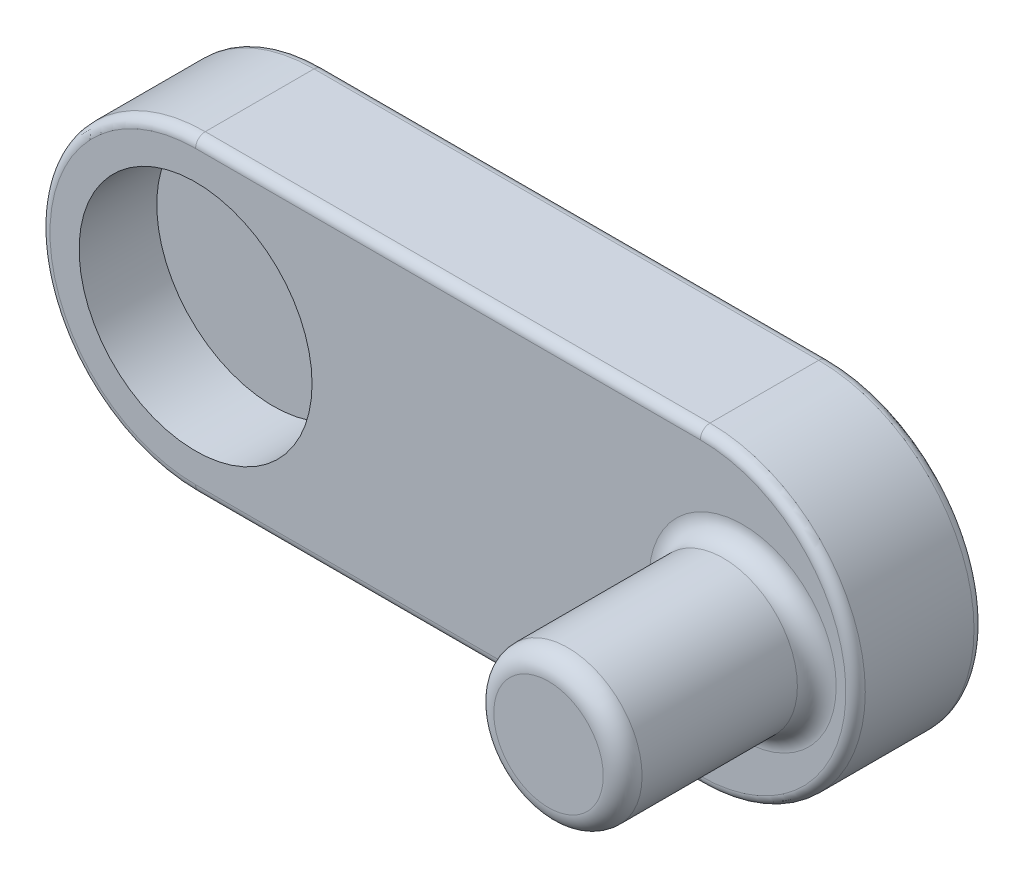
ISO-10303-21;
HEADER;
FILE_DESCRIPTION(('STEP AP214'),'2;1');
FILE_NAME('part.step','',(''),(''),'','','');
FILE_SCHEMA(('AUTOMOTIVE_DESIGN { 1 0 10303 214 1 1 1 1 }'));
ENDSEC;
DATA;
#1=APPLICATION_CONTEXT('core data for automotive mechanical design processes');
#2=APPLICATION_PROTOCOL_DEFINITION('international standard','automotive_design',2000,#1);
#3=PRODUCT_CONTEXT('',#1,'mechanical');
#4=PRODUCT('Part','Part','',(#3));
#5=PRODUCT_RELATED_PRODUCT_CATEGORY('part','',(#4));
#6=PRODUCT_DEFINITION_FORMATION('','',#4);
#7=PRODUCT_DEFINITION_CONTEXT('part definition',#1,'design');
#8=PRODUCT_DEFINITION('design','',#6,#7);
#9=PRODUCT_DEFINITION_SHAPE('','',#8);
#10=(LENGTH_UNIT() NAMED_UNIT(*) SI_UNIT(.MILLI.,.METRE.));
#11=(NAMED_UNIT(*) PLANE_ANGLE_UNIT() SI_UNIT($,.RADIAN.));
#12=(NAMED_UNIT(*) SI_UNIT($,.STERADIAN.) SOLID_ANGLE_UNIT());
#13=UNCERTAINTY_MEASURE_WITH_UNIT(LENGTH_MEASURE(1.E-05),#10,'distance_accuracy_value','');
#14=(GEOMETRIC_REPRESENTATION_CONTEXT(3) GLOBAL_UNCERTAINTY_ASSIGNED_CONTEXT((#13)) GLOBAL_UNIT_ASSIGNED_CONTEXT((#10,
#11,#12)) REPRESENTATION_CONTEXT('',''));
#15=CARTESIAN_POINT('',(0.,0.,0.));
#16=DIRECTION('',(0.,0.,1.));
#17=DIRECTION('',(1.,0.,0.));
#18=AXIS2_PLACEMENT_3D('',#15,#16,#17);
#19=CARTESIAN_POINT('',(0.,0.,33.));
#20=DIRECTION('',(0.,0.,-1.));
#21=DIRECTION('',(-1.,0.,0.));
#22=AXIS2_PLACEMENT_3D('',#19,#20,#21);
#23=CYLINDRICAL_SURFACE('',#22,40.);
#24=DIRECTION('',(0.,0.,-1.));
#25=VECTOR('',#24,1.);
#26=CARTESIAN_POINT('',(0.,40.,33.));
#27=LINE('',#26,#25);
#28=CARTESIAN_POINT('',(0.,40.,30.5));
#29=VERTEX_POINT('',#28);
#30=CARTESIAN_POINT('',(0.,40.,2.5));
#31=VERTEX_POINT('',#30);
#32=EDGE_CURVE('E391',#29,#31,#27,.T.);
#33=ORIENTED_EDGE('',*,*,#32,.T.);
#34=CARTESIAN_POINT('',(0.,0.,2.5));
#35=DIRECTION('',(0.,0.,1.));
#36=DIRECTION('',(1.,0.,0.));
#37=AXIS2_PLACEMENT_3D('',#34,#35,#36);
#38=CIRCLE('',#37,40.);
#39=CARTESIAN_POINT('',(0.,-40.,2.5));
#40=VERTEX_POINT('',#39);
#41=EDGE_CURVE('E432',#31,#40,#38,.T.);
#42=ORIENTED_EDGE('',*,*,#41,.T.);
#43=DIRECTION('',(0.,0.,-1.));
#44=VECTOR('',#43,1.);
#45=CARTESIAN_POINT('',(0.,-40.,33.));
#46=LINE('',#45,#44);
#47=CARTESIAN_POINT('',(0.,-40.,30.5));
#48=VERTEX_POINT('',#47);
#49=EDGE_CURVE('E135',#48,#40,#46,.T.);
#50=ORIENTED_EDGE('',*,*,#49,.F.);
#51=CARTESIAN_POINT('',(0.,0.,30.5));
#52=DIRECTION('',(0.,0.,1.));
#53=DIRECTION('',(1.,0.,0.));
#54=AXIS2_PLACEMENT_3D('',#51,#52,#53);
#55=CIRCLE('',#54,40.);
#56=EDGE_CURVE('E403',#48,#29,#55,.F.);
#57=ORIENTED_EDGE('',*,*,#56,.T.);
#58=EDGE_LOOP('',(#33,#42,#50,#57));
#59=FACE_BOUND('',#58,.T.);
#60=ADVANCED_FACE('F45',(#59),#23,.T.);
#61=CARTESIAN_POINT('',(0.,-40.,33.));
#62=DIRECTION('',(0.,1.,0.));
#63=DIRECTION('',(0.,0.,1.));
#64=AXIS2_PLACEMENT_3D('',#61,#62,#63);
#65=PLANE('',#64);
#66=ORIENTED_EDGE('',*,*,#49,.T.);
#67=DIRECTION('',(1.,0.,0.));
#68=VECTOR('',#67,1.);
#69=CARTESIAN_POINT('',(0.,-40.,2.5));
#70=LINE('',#69,#68);
#71=CARTESIAN_POINT('',(130.,-40.,2.5));
#72=VERTEX_POINT('',#71);
#73=EDGE_CURVE('E133',#40,#72,#70,.T.);
#74=ORIENTED_EDGE('',*,*,#73,.T.);
#75=DIRECTION('',(0.,0.,-1.));
#76=VECTOR('',#75,1.);
#77=CARTESIAN_POINT('',(130.,-40.,33.));
#78=LINE('',#77,#76);
#79=CARTESIAN_POINT('',(130.,-40.,30.5));
#80=VERTEX_POINT('',#79);
#81=EDGE_CURVE('E115',#80,#72,#78,.T.);
#82=ORIENTED_EDGE('',*,*,#81,.F.);
#83=DIRECTION('',(1.,0.,0.));
#84=VECTOR('',#83,1.);
#85=CARTESIAN_POINT('',(0.,-40.,30.5));
#86=LINE('',#85,#84);
#87=EDGE_CURVE('E130',#80,#48,#86,.F.);
#88=ORIENTED_EDGE('',*,*,#87,.T.);
#89=EDGE_LOOP('',(#66,#74,#82,#88));
#90=FACE_BOUND('',#89,.T.);
#91=ADVANCED_FACE('F129',(#90),#65,.F.);
#92=CARTESIAN_POINT('',(130.,0.,33.));
#93=DIRECTION('',(0.,0.,-1.));
#94=DIRECTION('',(-1.,0.,0.));
#95=AXIS2_PLACEMENT_3D('',#92,#93,#94);
#96=CYLINDRICAL_SURFACE('',#95,40.);
#97=ORIENTED_EDGE('',*,*,#81,.T.);
#98=CARTESIAN_POINT('',(130.,0.,2.5));
#99=DIRECTION('',(0.,0.,1.));
#100=DIRECTION('',(1.,0.,0.));
#101=AXIS2_PLACEMENT_3D('',#98,#99,#100);
#102=CIRCLE('',#101,40.);
#103=CARTESIAN_POINT('',(130.,40.,2.5));
#104=VERTEX_POINT('',#103);
#105=EDGE_CURVE('E122',#72,#104,#102,.T.);
#106=ORIENTED_EDGE('',*,*,#105,.T.);
#107=DIRECTION('',(0.,0.,-1.));
#108=VECTOR('',#107,1.);
#109=CARTESIAN_POINT('',(130.,40.,33.));
#110=LINE('',#109,#108);
#111=CARTESIAN_POINT('',(130.,40.,30.5));
#112=VERTEX_POINT('',#111);
#113=EDGE_CURVE('E117',#112,#104,#110,.T.);
#114=ORIENTED_EDGE('',*,*,#113,.F.);
#115=CARTESIAN_POINT('',(130.,0.,30.5));
#116=DIRECTION('',(0.,0.,1.));
#117=DIRECTION('',(1.,0.,0.));
#118=AXIS2_PLACEMENT_3D('',#115,#116,#117);
#119=CIRCLE('',#118,40.);
#120=EDGE_CURVE('E112',#112,#80,#119,.F.);
#121=ORIENTED_EDGE('',*,*,#120,.T.);
#122=EDGE_LOOP('',(#97,#106,#114,#121));
#123=FACE_BOUND('',#122,.T.);
#124=ADVANCED_FACE('F114',(#123),#96,.T.);
#125=CARTESIAN_POINT('',(0.,40.,33.));
#126=DIRECTION('',(0.,-1.,0.));
#127=DIRECTION('',(0.,0.,-1.));
#128=AXIS2_PLACEMENT_3D('',#125,#126,#127);
#129=PLANE('',#128);
#130=ORIENTED_EDGE('',*,*,#113,.T.);
#131=DIRECTION('',(-1.,0.,0.));
#132=VECTOR('',#131,1.);
#133=CARTESIAN_POINT('',(0.,40.,2.5));
#134=LINE('',#133,#132);
#135=EDGE_CURVE('E387',#104,#31,#134,.T.);
#136=ORIENTED_EDGE('',*,*,#135,.T.);
#137=ORIENTED_EDGE('',*,*,#32,.F.);
#138=DIRECTION('',(-1.,0.,0.));
#139=VECTOR('',#138,1.);
#140=CARTESIAN_POINT('',(130.,40.,30.5));
#141=LINE('',#140,#139);
#142=EDGE_CURVE('E389',#29,#112,#141,.F.);
#143=ORIENTED_EDGE('',*,*,#142,.T.);
#144=EDGE_LOOP('',(#130,#136,#137,#143));
#145=FACE_BOUND('',#144,.T.);
#146=ADVANCED_FACE('F302',(#145),#129,.F.);
#147=CARTESIAN_POINT('',(0.,0.,33.));
#148=DIRECTION('',(0.,0.,1.));
#149=DIRECTION('',(1.,0.,0.));
#150=AXIS2_PLACEMENT_3D('',#147,#148,#149);
#151=PLANE('',#150);
#152=CARTESIAN_POINT('',(140.909108461142,0.,33.));
#153=DIRECTION('',(0.,0.,1.));
#154=DIRECTION('',(1.,0.,0.));
#155=AXIS2_PLACEMENT_3D('',#152,#153,#154);
#156=CIRCLE('',#155,24.0966310594067);
#157=CARTESIAN_POINT('',(165.005739520548,0.,33.));
#158=VERTEX_POINT('',#157);
#159=EDGE_CURVE('E54',#158,#158,#156,.F.);
#160=ORIENTED_EDGE('',*,*,#159,.T.);
#161=EDGE_LOOP('',(#160));
#162=FACE_BOUND('',#161,.T.);
#163=CARTESIAN_POINT('',(0.,0.,33.));
#164=DIRECTION('',(0.,0.,1.));
#165=DIRECTION('',(1.,0.,0.));
#166=AXIS2_PLACEMENT_3D('',#163,#164,#165);
#167=CIRCLE('',#166,30.);
#168=CARTESIAN_POINT('',(30.,0.,33.));
#169=VERTEX_POINT('',#168);
#170=EDGE_CURVE('E458',#169,#169,#167,.T.);
#171=ORIENTED_EDGE('',*,*,#170,.F.);
#172=EDGE_LOOP('',(#171));
#173=FACE_BOUND('',#172,.T.);
#174=CARTESIAN_POINT('',(130.,0.,33.));
#175=DIRECTION('',(0.,0.,1.));
#176=DIRECTION('',(1.,0.,0.));
#177=AXIS2_PLACEMENT_3D('',#174,#175,#176);
#178=CIRCLE('',#177,37.5);
#179=CARTESIAN_POINT('',(130.,-37.5,33.));
#180=VERTEX_POINT('',#179);
#181=CARTESIAN_POINT('',(130.,37.5,33.));
#182=VERTEX_POINT('',#181);
#183=EDGE_CURVE('E61',#180,#182,#178,.T.);
#184=ORIENTED_EDGE('',*,*,#183,.T.);
#185=DIRECTION('',(-1.,0.,0.));
#186=VECTOR('',#185,1.);
#187=CARTESIAN_POINT('',(0.,37.5,33.));
#188=LINE('',#187,#186);
#189=CARTESIAN_POINT('',(0.,37.5,33.));
#190=VERTEX_POINT('',#189);
#191=EDGE_CURVE('E163',#182,#190,#188,.T.);
#192=ORIENTED_EDGE('',*,*,#191,.T.);
#193=CARTESIAN_POINT('',(0.,0.,33.));
#194=DIRECTION('',(0.,0.,1.));
#195=DIRECTION('',(1.,0.,0.));
#196=AXIS2_PLACEMENT_3D('',#193,#194,#195);
#197=CIRCLE('',#196,37.5);
#198=CARTESIAN_POINT('',(0.,-37.5,33.));
#199=VERTEX_POINT('',#198);
#200=EDGE_CURVE('E429',#190,#199,#197,.T.);
#201=ORIENTED_EDGE('',*,*,#200,.T.);
#202=DIRECTION('',(1.,0.,0.));
#203=VECTOR('',#202,1.);
#204=CARTESIAN_POINT('',(130.,-37.5,33.));
#205=LINE('',#204,#203);
#206=EDGE_CURVE('E66',#199,#180,#205,.T.);
#207=ORIENTED_EDGE('',*,*,#206,.T.);
#208=EDGE_LOOP('',(#184,#192,#201,#207));
#209=FACE_BOUND('',#208,.T.);
#210=ADVANCED_FACE('F170',(#162,#173,#209),#151,.T.);
#211=CARTESIAN_POINT('',(0.,0.,0.));
#212=DIRECTION('',(0.,0.,1.));
#213=DIRECTION('',(1.,0.,0.));
#214=AXIS2_PLACEMENT_3D('',#211,#212,#213);
#215=PLANE('',#214);
#216=CARTESIAN_POINT('',(130.,0.,0.));
#217=DIRECTION('',(0.,0.,-1.));
#218=DIRECTION('',(-1.,0.,0.));
#219=AXIS2_PLACEMENT_3D('',#216,#217,#218);
#220=CIRCLE('',#219,30.);
#221=CARTESIAN_POINT('',(100.,0.,0.));
#222=VERTEX_POINT('',#221);
#223=EDGE_CURVE('E466',#222,#222,#220,.T.);
#224=ORIENTED_EDGE('',*,*,#223,.F.);
#225=EDGE_LOOP('',(#224));
#226=FACE_BOUND('',#225,.T.);
#227=CARTESIAN_POINT('',(130.,0.,0.));
#228=DIRECTION('',(0.,0.,1.));
#229=DIRECTION('',(1.,0.,0.));
#230=AXIS2_PLACEMENT_3D('',#227,#228,#229);
#231=CIRCLE('',#230,37.5);
#232=CARTESIAN_POINT('',(130.,37.5,0.));
#233=VERTEX_POINT('',#232);
#234=CARTESIAN_POINT('',(130.,-37.5,0.));
#235=VERTEX_POINT('',#234);
#236=EDGE_CURVE('E407',#233,#235,#231,.F.);
#237=ORIENTED_EDGE('',*,*,#236,.T.);
#238=DIRECTION('',(1.,0.,0.));
#239=VECTOR('',#238,1.);
#240=CARTESIAN_POINT('',(0.,-37.5,0.));
#241=LINE('',#240,#239);
#242=CARTESIAN_POINT('',(0.,-37.5,0.));
#243=VERTEX_POINT('',#242);
#244=EDGE_CURVE('E123',#235,#243,#241,.F.);
#245=ORIENTED_EDGE('',*,*,#244,.T.);
#246=CARTESIAN_POINT('',(0.,0.,0.));
#247=DIRECTION('',(0.,0.,1.));
#248=DIRECTION('',(1.,0.,0.));
#249=AXIS2_PLACEMENT_3D('',#246,#247,#248);
#250=CIRCLE('',#249,37.5);
#251=CARTESIAN_POINT('',(0.,37.5,0.));
#252=VERTEX_POINT('',#251);
#253=EDGE_CURVE('E449',#243,#252,#250,.F.);
#254=ORIENTED_EDGE('',*,*,#253,.T.);
#255=DIRECTION('',(-1.,0.,0.));
#256=VECTOR('',#255,1.);
#257=CARTESIAN_POINT('',(0.,37.5,0.));
#258=LINE('',#257,#256);
#259=EDGE_CURVE('E446',#252,#233,#258,.F.);
#260=ORIENTED_EDGE('',*,*,#259,.T.);
#261=EDGE_LOOP('',(#237,#245,#254,#260));
#262=FACE_BOUND('',#261,.T.);
#263=ADVANCED_FACE('F219',(#226,#262),#215,.F.);
#264=CARTESIAN_POINT('',(0.,37.5,2.5));
#265=DIRECTION('',(-1.,0.,0.));
#266=DIRECTION('',(0.,0.,1.));
#267=AXIS2_PLACEMENT_3D('',#264,#265,#266);
#268=CYLINDRICAL_SURFACE('',#267,2.5);
#269=CARTESIAN_POINT('',(130.,37.5,2.5));
#270=DIRECTION('',(1.,0.,0.));
#271=DIRECTION('',(0.,0.,-1.));
#272=AXIS2_PLACEMENT_3D('',#269,#270,#271);
#273=CIRCLE('',#272,2.5);
#274=EDGE_CURVE('E397',#233,#104,#273,.T.);
#275=ORIENTED_EDGE('',*,*,#274,.F.);
#276=ORIENTED_EDGE('',*,*,#259,.F.);
#277=CARTESIAN_POINT('',(0.,37.5,2.5));
#278=DIRECTION('',(-1.,0.,0.));
#279=DIRECTION('',(0.,0.,1.));
#280=AXIS2_PLACEMENT_3D('',#277,#278,#279);
#281=CIRCLE('',#280,2.5);
#282=EDGE_CURVE('E400',#31,#252,#281,.T.);
#283=ORIENTED_EDGE('',*,*,#282,.F.);
#284=ORIENTED_EDGE('',*,*,#135,.F.);
#285=EDGE_LOOP('',(#275,#276,#283,#284));
#286=FACE_BOUND('',#285,.T.);
#287=ADVANCED_FACE('F215',(#286),#268,.T.);
#288=CARTESIAN_POINT('',(0.,0.,2.5));
#289=DIRECTION('',(0.,0.,1.));
#290=DIRECTION('',(1.,0.,0.));
#291=AXIS2_PLACEMENT_3D('',#288,#289,#290);
#292=TOROIDAL_SURFACE('',#291,37.5,2.5);
#293=ORIENTED_EDGE('',*,*,#282,.T.);
#294=ORIENTED_EDGE('',*,*,#253,.F.);
#295=CARTESIAN_POINT('',(0.,-37.5,2.5));
#296=DIRECTION('',(1.,0.,0.));
#297=DIRECTION('',(0.,0.,-1.));
#298=AXIS2_PLACEMENT_3D('',#295,#296,#297);
#299=CIRCLE('',#298,2.5);
#300=EDGE_CURVE('E152',#40,#243,#299,.T.);
#301=ORIENTED_EDGE('',*,*,#300,.F.);
#302=ORIENTED_EDGE('',*,*,#41,.F.);
#303=EDGE_LOOP('',(#293,#294,#301,#302));
#304=FACE_BOUND('',#303,.T.);
#305=ADVANCED_FACE('F211',(#304),#292,.T.);
#306=CARTESIAN_POINT('',(130.,0.,2.5));
#307=DIRECTION('',(0.,0.,1.));
#308=DIRECTION('',(1.,0.,0.));
#309=AXIS2_PLACEMENT_3D('',#306,#307,#308);
#310=TOROIDAL_SURFACE('',#309,37.5,2.5);
#311=ORIENTED_EDGE('',*,*,#274,.T.);
#312=ORIENTED_EDGE('',*,*,#105,.F.);
#313=CARTESIAN_POINT('',(130.,-37.5,2.5));
#314=DIRECTION('',(-1.,0.,0.));
#315=DIRECTION('',(0.,0.,1.));
#316=AXIS2_PLACEMENT_3D('',#313,#314,#315);
#317=CIRCLE('',#316,2.5);
#318=EDGE_CURVE('E148',#235,#72,#317,.T.);
#319=ORIENTED_EDGE('',*,*,#318,.F.);
#320=ORIENTED_EDGE('',*,*,#236,.F.);
#321=EDGE_LOOP('',(#311,#312,#319,#320));
#322=FACE_BOUND('',#321,.T.);
#323=ADVANCED_FACE('F207',(#322),#310,.T.);
#324=CARTESIAN_POINT('',(0.,-37.5,2.5));
#325=DIRECTION('',(1.,0.,0.));
#326=DIRECTION('',(0.,0.,-1.));
#327=AXIS2_PLACEMENT_3D('',#324,#325,#326);
#328=CYLINDRICAL_SURFACE('',#327,2.5);
#329=ORIENTED_EDGE('',*,*,#300,.T.);
#330=ORIENTED_EDGE('',*,*,#244,.F.);
#331=ORIENTED_EDGE('',*,*,#318,.T.);
#332=ORIENTED_EDGE('',*,*,#73,.F.);
#333=EDGE_LOOP('',(#329,#330,#331,#332));
#334=FACE_BOUND('',#333,.T.);
#335=ADVANCED_FACE('F204',(#334),#328,.T.);
#336=CARTESIAN_POINT('',(0.,-37.5,30.5));
#337=DIRECTION('',(-1.,0.,0.));
#338=DIRECTION('',(0.,0.,1.));
#339=AXIS2_PLACEMENT_3D('',#336,#337,#338);
#340=CYLINDRICAL_SURFACE('',#339,2.5);
#341=CARTESIAN_POINT('',(0.,-37.5,30.5));
#342=DIRECTION('',(-1.,0.,0.));
#343=DIRECTION('',(0.,0.,1.));
#344=AXIS2_PLACEMENT_3D('',#341,#342,#343);
#345=CIRCLE('',#344,2.5);
#346=EDGE_CURVE('E142',#48,#199,#345,.T.);
#347=ORIENTED_EDGE('',*,*,#346,.F.);
#348=ORIENTED_EDGE('',*,*,#87,.F.);
#349=CARTESIAN_POINT('',(130.,-37.5,30.5));
#350=DIRECTION('',(1.,0.,0.));
#351=DIRECTION('',(0.,0.,-1.));
#352=AXIS2_PLACEMENT_3D('',#349,#350,#351);
#353=CIRCLE('',#352,2.5);
#354=EDGE_CURVE('E140',#180,#80,#353,.T.);
#355=ORIENTED_EDGE('',*,*,#354,.F.);
#356=ORIENTED_EDGE('',*,*,#206,.F.);
#357=EDGE_LOOP('',(#347,#348,#355,#356));
#358=FACE_BOUND('',#357,.T.);
#359=ADVANCED_FACE('F139',(#358),#340,.T.);
#360=CARTESIAN_POINT('',(130.,0.,30.5));
#361=DIRECTION('',(0.,0.,1.));
#362=DIRECTION('',(1.,0.,0.));
#363=AXIS2_PLACEMENT_3D('',#360,#361,#362);
#364=TOROIDAL_SURFACE('',#363,37.5,2.5);
#365=ORIENTED_EDGE('',*,*,#354,.T.);
#366=ORIENTED_EDGE('',*,*,#120,.F.);
#367=CARTESIAN_POINT('',(130.,37.5,30.5));
#368=DIRECTION('',(-1.,0.,0.));
#369=DIRECTION('',(0.,0.,1.));
#370=AXIS2_PLACEMENT_3D('',#367,#368,#369);
#371=CIRCLE('',#370,2.5);
#372=EDGE_CURVE('E154',#182,#112,#371,.T.);
#373=ORIENTED_EDGE('',*,*,#372,.F.);
#374=ORIENTED_EDGE('',*,*,#183,.F.);
#375=EDGE_LOOP('',(#365,#366,#373,#374));
#376=FACE_BOUND('',#375,.T.);
#377=ADVANCED_FACE('F146',(#376),#364,.T.);
#378=CARTESIAN_POINT('',(0.,0.,30.5));
#379=DIRECTION('',(0.,0.,1.));
#380=DIRECTION('',(1.,0.,0.));
#381=AXIS2_PLACEMENT_3D('',#378,#379,#380);
#382=TOROIDAL_SURFACE('',#381,37.5,2.5);
#383=ORIENTED_EDGE('',*,*,#346,.T.);
#384=ORIENTED_EDGE('',*,*,#200,.F.);
#385=CARTESIAN_POINT('',(0.,37.5,30.5));
#386=DIRECTION('',(1.,0.,0.));
#387=DIRECTION('',(0.,0.,-1.));
#388=AXIS2_PLACEMENT_3D('',#385,#386,#387);
#389=CIRCLE('',#388,2.5);
#390=EDGE_CURVE('E415',#29,#190,#389,.T.);
#391=ORIENTED_EDGE('',*,*,#390,.F.);
#392=ORIENTED_EDGE('',*,*,#56,.F.);
#393=EDGE_LOOP('',(#383,#384,#391,#392));
#394=FACE_BOUND('',#393,.T.);
#395=ADVANCED_FACE('F225',(#394),#382,.T.);
#396=CARTESIAN_POINT('',(0.,37.5,30.5));
#397=DIRECTION('',(1.,0.,0.));
#398=DIRECTION('',(0.,0.,-1.));
#399=AXIS2_PLACEMENT_3D('',#396,#397,#398);
#400=CYLINDRICAL_SURFACE('',#399,2.5);
#401=ORIENTED_EDGE('',*,*,#372,.T.);
#402=ORIENTED_EDGE('',*,*,#142,.F.);
#403=ORIENTED_EDGE('',*,*,#390,.T.);
#404=ORIENTED_EDGE('',*,*,#191,.F.);
#405=EDGE_LOOP('',(#401,#402,#403,#404));
#406=FACE_BOUND('',#405,.T.);
#407=ADVANCED_FACE('F221',(#406),#400,.T.);
#408=CARTESIAN_POINT('',(0.,0.,13.));
#409=DIRECTION('',(0.,0.,1.));
#410=DIRECTION('',(1.,0.,0.));
#411=AXIS2_PLACEMENT_3D('',#408,#409,#410);
#412=CYLINDRICAL_SURFACE('',#411,30.);
#413=CARTESIAN_POINT('',(0.,0.,13.));
#414=DIRECTION('',(0.,0.,1.));
#415=DIRECTION('',(1.,0.,0.));
#416=AXIS2_PLACEMENT_3D('',#413,#414,#415);
#417=CIRCLE('',#416,30.);
#418=CARTESIAN_POINT('',(30.,0.,13.));
#419=VERTEX_POINT('',#418);
#420=EDGE_CURVE('E417',#419,#419,#417,.T.);
#421=ORIENTED_EDGE('',*,*,#420,.F.);
#422=EDGE_LOOP('',(#421));
#423=FACE_BOUND('',#422,.T.);
#424=ORIENTED_EDGE('',*,*,#170,.T.);
#425=EDGE_LOOP('',(#424));
#426=FACE_BOUND('',#425,.T.);
#427=ADVANCED_FACE('F224',(#423,#426),#412,.F.);
#428=CARTESIAN_POINT('',(0.,0.,13.));
#429=DIRECTION('',(0.,0.,1.));
#430=DIRECTION('',(1.,0.,0.));
#431=AXIS2_PLACEMENT_3D('',#428,#429,#430);
#432=PLANE('',#431);
#433=ORIENTED_EDGE('',*,*,#420,.T.);
#434=EDGE_LOOP('',(#433));
#435=FACE_BOUND('',#434,.T.);
#436=ADVANCED_FACE('F259',(#435),#432,.T.);
#437=CARTESIAN_POINT('',(130.,0.,20.));
#438=DIRECTION('',(0.,0.,-1.));
#439=DIRECTION('',(-1.,0.,0.));
#440=AXIS2_PLACEMENT_3D('',#437,#438,#439);
#441=CYLINDRICAL_SURFACE('',#440,30.);
#442=CARTESIAN_POINT('',(130.,0.,20.));
#443=DIRECTION('',(0.,0.,-1.));
#444=DIRECTION('',(-1.,0.,0.));
#445=AXIS2_PLACEMENT_3D('',#442,#443,#444);
#446=CIRCLE('',#445,30.);
#447=CARTESIAN_POINT('',(100.,0.,20.));
#448=VERTEX_POINT('',#447);
#449=EDGE_CURVE('E462',#448,#448,#446,.T.);
#450=ORIENTED_EDGE('',*,*,#449,.F.);
#451=EDGE_LOOP('',(#450));
#452=FACE_BOUND('',#451,.T.);
#453=ORIENTED_EDGE('',*,*,#223,.T.);
#454=EDGE_LOOP('',(#453));
#455=FACE_BOUND('',#454,.T.);
#456=ADVANCED_FACE('F268',(#452,#455),#441,.F.);
#457=CARTESIAN_POINT('',(130.,0.,20.));
#458=DIRECTION('',(0.,0.,-1.));
#459=DIRECTION('',(-1.,0.,0.));
#460=AXIS2_PLACEMENT_3D('',#457,#458,#459);
#461=PLANE('',#460);
#462=ORIENTED_EDGE('',*,*,#449,.T.);
#463=EDGE_LOOP('',(#462));
#464=FACE_BOUND('',#463,.T.);
#465=ADVANCED_FACE('F182',(#464),#461,.T.);
#466=CARTESIAN_POINT('',(140.909108461142,0.,83.));
#467=DIRECTION('',(0.,0.,-1.));
#468=DIRECTION('',(-1.,0.,0.));
#469=AXIS2_PLACEMENT_3D('',#466,#467,#468);
#470=CYLINDRICAL_SURFACE('',#469,19.0966310594067);
#471=CARTESIAN_POINT('',(140.909108461142,0.,38.));
#472=DIRECTION('',(0.,0.,1.));
#473=DIRECTION('',(1.,0.,0.));
#474=AXIS2_PLACEMENT_3D('',#471,#472,#473);
#475=CIRCLE('',#474,19.0966310594067);
#476=CARTESIAN_POINT('',(160.005739520548,0.,38.));
#477=VERTEX_POINT('',#476);
#478=EDGE_CURVE('E162',#477,#477,#475,.T.);
#479=ORIENTED_EDGE('',*,*,#478,.T.);
#480=EDGE_LOOP('',(#479));
#481=FACE_BOUND('',#480,.T.);
#482=CARTESIAN_POINT('',(140.909108461142,0.,78.));
#483=DIRECTION('',(0.,0.,1.));
#484=DIRECTION('',(1.,0.,0.));
#485=AXIS2_PLACEMENT_3D('',#482,#483,#484);
#486=CIRCLE('',#485,19.0966310594067);
#487=CARTESIAN_POINT('',(160.005739520548,0.,78.));
#488=VERTEX_POINT('',#487);
#489=EDGE_CURVE('E158',#488,#488,#486,.F.);
#490=ORIENTED_EDGE('',*,*,#489,.T.);
#491=EDGE_LOOP('',(#490));
#492=FACE_BOUND('',#491,.T.);
#493=ADVANCED_FACE('F179',(#481,#492),#470,.T.);
#494=CARTESIAN_POINT('',(140.909108461142,0.,83.));
#495=DIRECTION('',(0.,0.,1.));
#496=DIRECTION('',(1.,0.,0.));
#497=AXIS2_PLACEMENT_3D('',#494,#495,#496);
#498=PLANE('',#497);
#499=CARTESIAN_POINT('',(140.909108461142,0.,83.));
#500=DIRECTION('',(0.,0.,1.));
#501=DIRECTION('',(1.,0.,0.));
#502=AXIS2_PLACEMENT_3D('',#499,#500,#501);
#503=CIRCLE('',#502,14.0966310594067);
#504=CARTESIAN_POINT('',(155.005739520548,0.,83.));
#505=VERTEX_POINT('',#504);
#506=EDGE_CURVE('E11',#505,#505,#503,.T.);
#507=ORIENTED_EDGE('',*,*,#506,.T.);
#508=EDGE_LOOP('',(#507));
#509=FACE_BOUND('',#508,.T.);
#510=ADVANCED_FACE('F176',(#509),#498,.T.);
#511=CARTESIAN_POINT('',(140.909108461142,0.,38.));
#512=DIRECTION('',(0.,0.,1.));
#513=DIRECTION('',(1.,0.,0.));
#514=AXIS2_PLACEMENT_3D('',#511,#512,#513);
#515=TOROIDAL_SURFACE('',#514,24.0966310594067,5.);
#516=ORIENTED_EDGE('',*,*,#159,.F.);
#517=EDGE_LOOP('',(#516));
#518=FACE_BOUND('',#517,.T.);
#519=ORIENTED_EDGE('',*,*,#478,.F.);
#520=EDGE_LOOP('',(#519));
#521=FACE_BOUND('',#520,.T.);
#522=ADVANCED_FACE('F173',(#518,#521),#515,.F.);
#523=CARTESIAN_POINT('',(140.909108461142,0.,78.));
#524=DIRECTION('',(0.,0.,1.));
#525=DIRECTION('',(1.,0.,0.));
#526=AXIS2_PLACEMENT_3D('',#523,#524,#525);
#527=TOROIDAL_SURFACE('',#526,14.0966310594067,5.);
#528=ORIENTED_EDGE('',*,*,#489,.F.);
#529=EDGE_LOOP('',(#528));
#530=FACE_BOUND('',#529,.T.);
#531=ORIENTED_EDGE('',*,*,#506,.F.);
#532=EDGE_LOOP('',(#531));
#533=FACE_BOUND('',#532,.T.);
#534=ADVANCED_FACE('F47',(#530,#533),#527,.T.);
#535=CLOSED_SHELL('',(#60,#91,#124,#146,#210,#263,#287,#305,#323,#335,#359,#377,#395,#407,#427,
#436,#456,#465,#493,#510,#522,#534));
#536=MANIFOLD_SOLID_BREP('B2',#535);
#537=ADVANCED_BREP_SHAPE_REPRESENTATION('',(#18,#536),#14);
#538=SHAPE_DEFINITION_REPRESENTATION(#9,#537);
ENDSEC;
END-ISO-10303-21;
